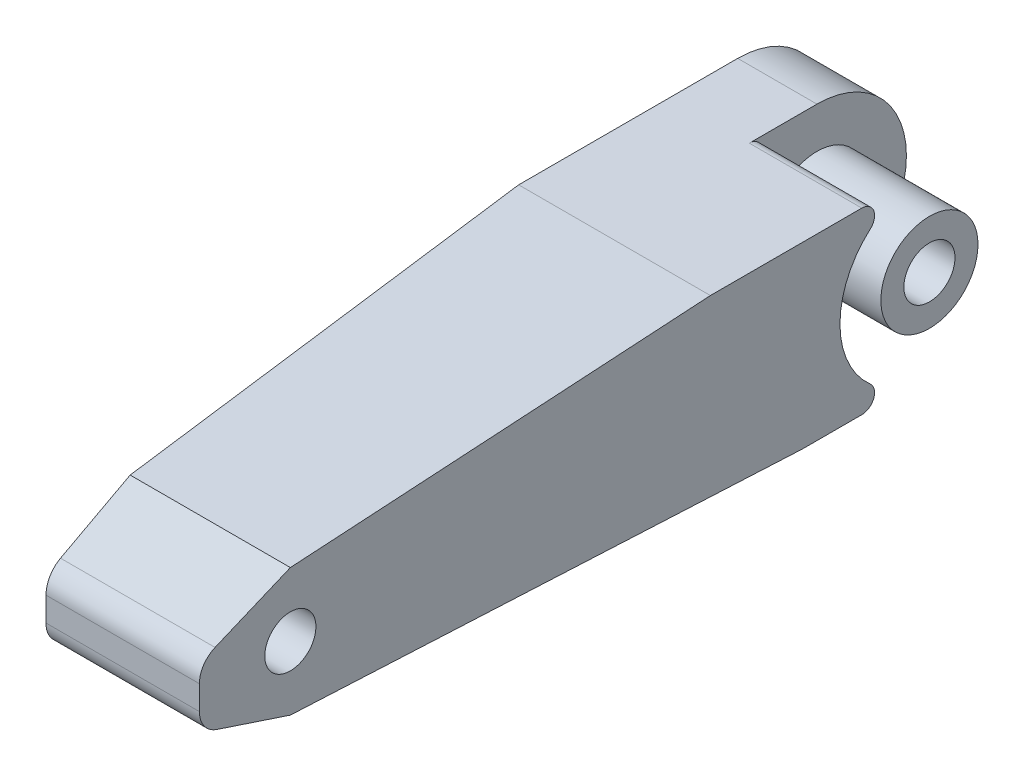
ISO-10303-21;
HEADER;
FILE_DESCRIPTION(('STEP AP214'),'2;1');
FILE_NAME('part.step','',(''),(''),'','','');
FILE_SCHEMA(('AUTOMOTIVE_DESIGN { 1 0 10303 214 1 1 1 1 }'));
ENDSEC;
DATA;
#1=APPLICATION_CONTEXT('core data for automotive mechanical design processes');
#2=APPLICATION_PROTOCOL_DEFINITION('international standard','automotive_design',2000,#1);
#3=PRODUCT_CONTEXT('',#1,'mechanical');
#4=PRODUCT('Part','Part','',(#3));
#5=PRODUCT_RELATED_PRODUCT_CATEGORY('part','',(#4));
#6=PRODUCT_DEFINITION_FORMATION('','',#4);
#7=PRODUCT_DEFINITION_CONTEXT('part definition',#1,'design');
#8=PRODUCT_DEFINITION('design','',#6,#7);
#9=PRODUCT_DEFINITION_SHAPE('','',#8);
#10=(LENGTH_UNIT() NAMED_UNIT(*) SI_UNIT(.MILLI.,.METRE.));
#11=(NAMED_UNIT(*) PLANE_ANGLE_UNIT() SI_UNIT($,.RADIAN.));
#12=(NAMED_UNIT(*) SI_UNIT($,.STERADIAN.) SOLID_ANGLE_UNIT());
#13=UNCERTAINTY_MEASURE_WITH_UNIT(LENGTH_MEASURE(1.E-05),#10,'distance_accuracy_value','');
#14=(GEOMETRIC_REPRESENTATION_CONTEXT(3) GLOBAL_UNCERTAINTY_ASSIGNED_CONTEXT((#13)) GLOBAL_UNIT_ASSIGNED_CONTEXT((#10,
#11,#12)) REPRESENTATION_CONTEXT('',''));
#15=CARTESIAN_POINT('',(0.,0.,0.));
#16=DIRECTION('',(0.,0.,1.));
#17=DIRECTION('',(1.,0.,0.));
#18=AXIS2_PLACEMENT_3D('',#15,#16,#17);
#19=CARTESIAN_POINT('',(-7.5,0.,-12.5));
#20=DIRECTION('',(1.,0.,0.));
#21=DIRECTION('',(0.,0.,-1.));
#22=AXIS2_PLACEMENT_3D('',#19,#20,#21);
#23=CYLINDRICAL_SURFACE('',#22,3.5);
#24=CARTESIAN_POINT('',(-4.4,0.,-12.5));
#25=DIRECTION('',(1.,0.,0.));
#26=DIRECTION('',(0.,0.,-1.));
#27=AXIS2_PLACEMENT_3D('',#24,#25,#26);
#28=CIRCLE('',#27,3.5);
#29=CARTESIAN_POINT('',(-4.4,-3.5,-12.5));
#30=VERTEX_POINT('',#29);
#31=CARTESIAN_POINT('',(-4.4,3.5,-12.5));
#32=VERTEX_POINT('',#31);
#33=EDGE_CURVE('E373',#30,#32,#28,.T.);
#34=ORIENTED_EDGE('',*,*,#33,.F.);
#35=DIRECTION('',(1.,0.,0.));
#36=VECTOR('',#35,1.);
#37=CARTESIAN_POINT('',(-7.5,-3.5,-12.5));
#38=LINE('',#37,#36);
#39=CARTESIAN_POINT('',(-7.5,-3.5,-12.5));
#40=VERTEX_POINT('',#39);
#41=EDGE_CURVE('E437',#40,#30,#38,.T.);
#42=ORIENTED_EDGE('',*,*,#41,.F.);
#43=CARTESIAN_POINT('',(-7.5,0.,-12.5));
#44=DIRECTION('',(1.,0.,0.));
#45=DIRECTION('',(0.,0.,-1.));
#46=AXIS2_PLACEMENT_3D('',#43,#44,#45);
#47=CIRCLE('',#46,3.5);
#48=CARTESIAN_POINT('',(-7.5,3.5,-12.5));
#49=VERTEX_POINT('',#48);
#50=EDGE_CURVE('E385',#49,#40,#47,.F.);
#51=ORIENTED_EDGE('',*,*,#50,.F.);
#52=DIRECTION('',(1.,0.,0.));
#53=VECTOR('',#52,1.);
#54=CARTESIAN_POINT('',(-7.5,3.5,-12.5));
#55=LINE('',#54,#53);
#56=EDGE_CURVE('E433',#49,#32,#55,.T.);
#57=ORIENTED_EDGE('',*,*,#56,.T.);
#58=EDGE_LOOP('',(#34,#42,#51,#57));
#59=FACE_BOUND('',#58,.T.);
#60=ADVANCED_FACE('F43',(#59),#23,.T.);
#61=CARTESIAN_POINT('',(-7.5,6.58121166022719,2.75669465493529));
#62=DIRECTION('',(0.,0.922352663952775,0.386349017468946));
#63=DIRECTION('',(0.,-0.386349017468946,0.922352663952775));
#64=AXIS2_PLACEMENT_3D('',#61,#62,#63);
#65=PLANE('',#64);
#66=DIRECTION('',(-0.0690481216036212,0.385426929996774,-0.920151312848204));
#67=VECTOR('',#66,1.);
#68=CARTESIAN_POINT('',(-7.00056919332682,6.59456668704934,2.72481145086436));
#69=LINE('',#68,#67);
#70=CARTESIAN_POINT('',(-6.04604834777971,1.26642696980822,15.4449780357449));
#71=VERTEX_POINT('',#70);
#72=CARTESIAN_POINT('',(-6.26703939424432,2.5,12.5));
#73=VERTEX_POINT('',#72);
#74=EDGE_CURVE('E351',#71,#73,#69,.T.);
#75=ORIENTED_EDGE('',*,*,#74,.F.);
#76=DIRECTION('',(1.,0.,0.));
#77=VECTOR('',#76,1.);
#78=CARTESIAN_POINT('',(-7.5,1.26642696980822,15.4449780357449));
#79=LINE('',#78,#77);
#80=CARTESIAN_POINT('',(0.,1.26642696980822,15.4449780357449));
#81=VERTEX_POINT('',#80);
#82=EDGE_CURVE('E392',#71,#81,#79,.T.);
#83=ORIENTED_EDGE('',*,*,#82,.T.);
#84=DIRECTION('',(0.,-0.386349017468946,0.922352663952775));
#85=VECTOR('',#84,1.);
#86=CARTESIAN_POINT('',(0.,6.58121166022719,2.75669465493529));
#87=LINE('',#86,#85);
#88=CARTESIAN_POINT('',(0.,2.5,12.5));
#89=VERTEX_POINT('',#88);
#90=EDGE_CURVE('E372',#89,#81,#87,.T.);
#91=ORIENTED_EDGE('',*,*,#90,.F.);
#92=DIRECTION('',(1.,0.,0.));
#93=VECTOR('',#92,1.);
#94=CARTESIAN_POINT('',(-7.5,2.5,12.5));
#95=LINE('',#94,#93);
#96=EDGE_CURVE('E425',#73,#89,#95,.T.);
#97=ORIENTED_EDGE('',*,*,#96,.F.);
#98=EDGE_LOOP('',(#75,#83,#91,#97));
#99=FACE_BOUND('',#98,.T.);
#100=ADVANCED_FACE('F550',(#99),#65,.T.);
#101=CARTESIAN_POINT('',(-7.5,3.24873633277452,0.197723314979145));
#102=DIRECTION('',(0.,0.9981530617779,0.0607491996935188));
#103=DIRECTION('',(0.,-0.0607491996935188,0.9981530617779));
#104=AXIS2_PLACEMENT_3D('',#101,#102,#103);
#105=PLANE('',#104);
#106=DIRECTION('',(-0.0746921435932384,0.060579505334203,-0.995364861354323));
#107=VECTOR('',#106,1.);
#108=CARTESIAN_POINT('',(-7.19193013490415,3.25013811174686,0.174691077842942));
#109=LINE('',#108,#107);
#110=CARTESIAN_POINT('',(-7.5,3.5,-3.93071952904089));
#111=VERTEX_POINT('',#110);
#112=EDGE_CURVE('E354',#73,#111,#109,.T.);
#113=ORIENTED_EDGE('',*,*,#112,.F.);
#114=ORIENTED_EDGE('',*,*,#96,.T.);
#115=DIRECTION('',(0.,-0.0607491996935188,0.9981530617779));
#116=VECTOR('',#115,1.);
#117=CARTESIAN_POINT('',(0.,3.24873633277452,0.197723314979145));
#118=LINE('',#117,#116);
#119=CARTESIAN_POINT('',(0.,3.5,-3.93071952904089));
#120=VERTEX_POINT('',#119);
#121=EDGE_CURVE('E382',#120,#89,#118,.T.);
#122=ORIENTED_EDGE('',*,*,#121,.F.);
#123=DIRECTION('',(1.,0.,0.));
#124=VECTOR('',#123,1.);
#125=CARTESIAN_POINT('',(-7.5,3.5,-3.93071952904089));
#126=LINE('',#125,#124);
#127=EDGE_CURVE('E429',#111,#120,#126,.T.);
#128=ORIENTED_EDGE('',*,*,#127,.F.);
#129=EDGE_LOOP('',(#113,#114,#122,#128));
#130=FACE_BOUND('',#129,.T.);
#131=ADVANCED_FACE('F556',(#130),#105,.T.);
#132=CARTESIAN_POINT('',(-7.5,3.5,0.));
#133=DIRECTION('',(0.,1.,0.));
#134=DIRECTION('',(0.,0.,1.));
#135=AXIS2_PLACEMENT_3D('',#132,#133,#134);
#136=PLANE('',#135);
#137=DIRECTION('',(0.,0.,1.));
#138=VECTOR('',#137,1.);
#139=CARTESIAN_POINT('',(0.,3.5,0.));
#140=LINE('',#139,#138);
#141=CARTESIAN_POINT('',(0.,3.5,-9.85424868893541));
#142=VERTEX_POINT('',#141);
#143=EDGE_CURVE('E419',#142,#120,#140,.T.);
#144=ORIENTED_EDGE('',*,*,#143,.F.);
#145=DIRECTION('',(-1.,0.,0.));
#146=VECTOR('',#145,1.);
#147=CARTESIAN_POINT('',(-4.4,3.5,-9.85424868893541));
#148=LINE('',#147,#146);
#149=CARTESIAN_POINT('',(-4.4,3.5,-9.85424868893541));
#150=VERTEX_POINT('',#149);
#151=EDGE_CURVE('E482',#142,#150,#148,.T.);
#152=ORIENTED_EDGE('',*,*,#151,.T.);
#153=DIRECTION('',(0.,0.,-1.));
#154=VECTOR('',#153,1.);
#155=CARTESIAN_POINT('',(-4.4,3.5,0.));
#156=LINE('',#155,#154);
#157=EDGE_CURVE('E479',#150,#32,#156,.T.);
#158=ORIENTED_EDGE('',*,*,#157,.T.);
#159=ORIENTED_EDGE('',*,*,#56,.F.);
#160=DIRECTION('',(0.,0.,1.));
#161=VECTOR('',#160,1.);
#162=CARTESIAN_POINT('',(-7.5,3.5,0.));
#163=LINE('',#162,#161);
#164=EDGE_CURVE('E388',#49,#111,#163,.T.);
#165=ORIENTED_EDGE('',*,*,#164,.T.);
#166=ORIENTED_EDGE('',*,*,#127,.T.);
#167=EDGE_LOOP('',(#144,#152,#158,#159,#165,#166));
#168=FACE_BOUND('',#167,.T.);
#169=ADVANCED_FACE('F562',(#168),#136,.T.);
#170=CARTESIAN_POINT('',(-7.5,-3.5,0.));
#171=DIRECTION('',(0.,1.,0.));
#172=DIRECTION('',(0.,0.,1.));
#173=AXIS2_PLACEMENT_3D('',#170,#171,#172);
#174=PLANE('',#173);
#175=DIRECTION('',(0.,0.,1.));
#176=VECTOR('',#175,1.);
#177=CARTESIAN_POINT('',(-4.4,-3.5,-12.5));
#178=LINE('',#177,#176);
#179=CARTESIAN_POINT('',(-4.4,-3.5,-9.85424868893541));
#180=VERTEX_POINT('',#179);
#181=EDGE_CURVE('E428',#30,#180,#178,.T.);
#182=ORIENTED_EDGE('',*,*,#181,.T.);
#183=DIRECTION('',(1.,0.,0.));
#184=VECTOR('',#183,1.);
#185=CARTESIAN_POINT('',(-7.5,-3.5,-9.85424868893541));
#186=LINE('',#185,#184);
#187=CARTESIAN_POINT('',(0.,-3.5,-9.85424868893541));
#188=VERTEX_POINT('',#187);
#189=EDGE_CURVE('E462',#180,#188,#186,.T.);
#190=ORIENTED_EDGE('',*,*,#189,.T.);
#191=DIRECTION('',(0.,0.,1.));
#192=VECTOR('',#191,1.);
#193=CARTESIAN_POINT('',(0.,-3.5,0.));
#194=LINE('',#193,#192);
#195=CARTESIAN_POINT('',(0.,-3.5,-7.52880226755794));
#196=VERTEX_POINT('',#195);
#197=EDGE_CURVE('E416',#188,#196,#194,.T.);
#198=ORIENTED_EDGE('',*,*,#197,.T.);
#199=DIRECTION('',(1.,0.,0.));
#200=VECTOR('',#199,1.);
#201=CARTESIAN_POINT('',(-7.5,-3.5,-7.52880226755794));
#202=LINE('',#201,#200);
#203=CARTESIAN_POINT('',(-7.5,-3.5,-7.52880226755794));
#204=VERTEX_POINT('',#203);
#205=EDGE_CURVE('E441',#204,#196,#202,.T.);
#206=ORIENTED_EDGE('',*,*,#205,.F.);
#207=DIRECTION('',(0.,0.,1.));
#208=VECTOR('',#207,1.);
#209=CARTESIAN_POINT('',(-7.5,-3.5,0.));
#210=LINE('',#209,#208);
#211=EDGE_CURVE('E381',#40,#204,#210,.T.);
#212=ORIENTED_EDGE('',*,*,#211,.F.);
#213=ORIENTED_EDGE('',*,*,#41,.T.);
#214=EDGE_LOOP('',(#182,#190,#198,#206,#212,#213));
#215=FACE_BOUND('',#214,.T.);
#216=ADVANCED_FACE('F564',(#215),#174,.F.);
#217=CARTESIAN_POINT('',(-7.5,-3.11633278250536,0.155592568186321));
#218=DIRECTION('',(0.,0.998755917988234,-0.0498659832298602));
#219=DIRECTION('',(0.,0.0498659832298602,0.998755917988234));
#220=AXIS2_PLACEMENT_3D('',#217,#218,#219);
#221=PLANE('',#220);
#222=DIRECTION('',(1.,0.,0.));
#223=VECTOR('',#222,1.);
#224=CARTESIAN_POINT('',(-7.5,-2.5,12.5));
#225=LINE('',#224,#223);
#226=CARTESIAN_POINT('',(-6.26703939424431,-2.5,12.5));
#227=VERTEX_POINT('',#226);
#228=CARTESIAN_POINT('',(0.,-2.5,12.5));
#229=VERTEX_POINT('',#228);
#230=EDGE_CURVE('E445',#227,#229,#225,.T.);
#231=ORIENTED_EDGE('',*,*,#230,.F.);
#232=DIRECTION('',(0.074737003632309,0.0497265220033703,0.995962676658876));
#233=VECTOR('',#232,1.);
#234=CARTESIAN_POINT('',(-7.57268935882462,-3.3687186873563,-4.89939481519172));
#235=LINE('',#234,#233);
#236=CARTESIAN_POINT('',(-7.5,-3.32035457285706,-3.9307195290409));
#237=VERTEX_POINT('',#236);
#238=EDGE_CURVE('E339',#237,#227,#235,.T.);
#239=ORIENTED_EDGE('',*,*,#238,.F.);
#240=DIRECTION('',(0.,0.0498659832298602,0.998755917988234));
#241=VECTOR('',#240,1.);
#242=CARTESIAN_POINT('',(-7.5,-3.11633278250536,0.155592568186321));
#243=LINE('',#242,#241);
#244=EDGE_CURVE('E377',#204,#237,#243,.T.);
#245=ORIENTED_EDGE('',*,*,#244,.F.);
#246=ORIENTED_EDGE('',*,*,#205,.T.);
#247=DIRECTION('',(0.,0.0498659832298602,0.998755917988234));
#248=VECTOR('',#247,1.);
#249=CARTESIAN_POINT('',(0.,-3.11633278250536,0.155592568186321));
#250=LINE('',#249,#248);
#251=EDGE_CURVE('E412',#196,#229,#250,.T.);
#252=ORIENTED_EDGE('',*,*,#251,.T.);
#253=EDGE_LOOP('',(#231,#239,#245,#246,#252));
#254=FACE_BOUND('',#253,.T.);
#255=ADVANCED_FACE('F567',(#254),#221,.F.);
#256=CARTESIAN_POINT('',(-7.5,-5.98077172134062,1.9786069110226));
#257=DIRECTION('',(0.,-0.949394439923338,0.314086289803697));
#258=DIRECTION('',(0.,-0.314086289803697,-0.949394439923338));
#259=AXIS2_PLACEMENT_3D('',#256,#257,#258);
#260=PLANE('',#259);
#261=DIRECTION('',(0.0710624145134578,0.313292239115599,0.946994248215612));
#262=VECTOR('',#261,1.);
#263=CARTESIAN_POINT('',(-7.05880364622664,-5.99064406344166,1.94876559987972));
#264=LINE('',#263,#262);
#265=CARTESIAN_POINT('',(-6.05147094027897,-1.54962526128772,15.3727153080797));
#266=VERTEX_POINT('',#265);
#267=EDGE_CURVE('E360',#227,#266,#264,.T.);
#268=ORIENTED_EDGE('',*,*,#267,.F.);
#269=ORIENTED_EDGE('',*,*,#230,.T.);
#270=DIRECTION('',(0.,-0.314086289803697,-0.949394439923338));
#271=VECTOR('',#270,1.);
#272=CARTESIAN_POINT('',(0.,-5.98077172134062,1.9786069110226));
#273=LINE('',#272,#271);
#274=CARTESIAN_POINT('',(0.,-1.54962526128772,15.3727153080797));
#275=VERTEX_POINT('',#274);
#276=EDGE_CURVE('E408',#275,#229,#273,.T.);
#277=ORIENTED_EDGE('',*,*,#276,.F.);
#278=DIRECTION('',(1.,0.,0.));
#279=VECTOR('',#278,1.);
#280=CARTESIAN_POINT('',(-7.5,-1.54962526128772,15.3727153080797));
#281=LINE('',#280,#279);
#282=EDGE_CURVE('E448',#266,#275,#281,.T.);
#283=ORIENTED_EDGE('',*,*,#282,.F.);
#284=EDGE_LOOP('',(#268,#269,#277,#283));
#285=FACE_BOUND('',#284,.T.);
#286=ADVANCED_FACE('F571',(#285),#260,.T.);
#287=CARTESIAN_POINT('',(-7.5,-0.600230821364385,15.058629018276));
#288=DIRECTION('',(1.,0.,0.));
#289=DIRECTION('',(0.,0.,-1.));
#290=AXIS2_PLACEMENT_3D('',#287,#288,#289);
#291=CYLINDRICAL_SURFACE('',#290,1.);
#292=CARTESIAN_POINT('',(-6.07503996423142,-0.600230821364385,15.058629018276));
#293=DIRECTION('',(0.997196336905722,0.,-0.074829577453106));
#294=DIRECTION('',(0.074829577453106,0.,0.997196336905722));
#295=AXIS2_PLACEMENT_3D('',#292,#293,#294);
#296=ELLIPSE('',#295,1.00281154572126,1.);
#297=CARTESIAN_POINT('',(-6.,-0.600230821364379,16.058629018276));
#298=VERTEX_POINT('',#297);
#299=EDGE_CURVE('E357',#266,#298,#296,.F.);
#300=ORIENTED_EDGE('',*,*,#299,.F.);
#301=ORIENTED_EDGE('',*,*,#282,.T.);
#302=CARTESIAN_POINT('',(0.,-0.600230821364385,15.058629018276));
#303=DIRECTION('',(1.,0.,0.));
#304=DIRECTION('',(0.,0.,-1.));
#305=AXIS2_PLACEMENT_3D('',#302,#303,#304);
#306=CIRCLE('',#305,1.);
#307=CARTESIAN_POINT('',(0.,-0.60023082136438,16.058629018276));
#308=VERTEX_POINT('',#307);
#309=EDGE_CURVE('E404',#308,#275,#306,.T.);
#310=ORIENTED_EDGE('',*,*,#309,.F.);
#311=DIRECTION('',(1.,0.,0.));
#312=VECTOR('',#311,1.);
#313=CARTESIAN_POINT('',(-7.5,-0.60023082136438,16.058629018276));
#314=LINE('',#313,#312);
#315=EDGE_CURVE('E451',#298,#308,#314,.T.);
#316=ORIENTED_EDGE('',*,*,#315,.F.);
#317=EDGE_LOOP('',(#300,#301,#310,#316));
#318=FACE_BOUND('',#317,.T.);
#319=ADVANCED_FACE('F575',(#318),#291,.T.);
#320=CARTESIAN_POINT('',(-7.5,0.,16.058629018276));
#321=DIRECTION('',(0.,0.,1.));
#322=DIRECTION('',(1.,0.,0.));
#323=AXIS2_PLACEMENT_3D('',#320,#321,#322);
#324=PLANE('',#323);
#325=DIRECTION('',(0.,1.,0.));
#326=VECTOR('',#325,1.);
#327=CARTESIAN_POINT('',(-6.,-22.8793736979123,16.058629018276));
#328=LINE('',#327,#326);
#329=CARTESIAN_POINT('',(-6.,0.344074305855445,16.058629018276));
#330=VERTEX_POINT('',#329);
#331=EDGE_CURVE('E343',#298,#330,#328,.T.);
#332=ORIENTED_EDGE('',*,*,#331,.F.);
#333=ORIENTED_EDGE('',*,*,#315,.T.);
#334=DIRECTION('',(0.,-1.,0.));
#335=VECTOR('',#334,1.);
#336=CARTESIAN_POINT('',(0.,0.,16.058629018276));
#337=LINE('',#336,#335);
#338=CARTESIAN_POINT('',(0.,0.344074305855439,16.058629018276));
#339=VERTEX_POINT('',#338);
#340=EDGE_CURVE('E400',#339,#308,#337,.T.);
#341=ORIENTED_EDGE('',*,*,#340,.F.);
#342=DIRECTION('',(1.,0.,0.));
#343=VECTOR('',#342,1.);
#344=CARTESIAN_POINT('',(-7.5,0.344074305855439,16.058629018276));
#345=LINE('',#344,#343);
#346=EDGE_CURVE('E454',#330,#339,#345,.T.);
#347=ORIENTED_EDGE('',*,*,#346,.F.);
#348=EDGE_LOOP('',(#332,#333,#341,#347));
#349=FACE_BOUND('',#348,.T.);
#350=ADVANCED_FACE('F579',(#349),#324,.T.);
#351=CARTESIAN_POINT('',(-7.5,0.344074305855444,15.058629018276));
#352=DIRECTION('',(1.,0.,0.));
#353=DIRECTION('',(0.,0.,-1.));
#354=AXIS2_PLACEMENT_3D('',#351,#352,#353);
#355=CYLINDRICAL_SURFACE('',#354,1.);
#356=CARTESIAN_POINT('',(-6.07503996423142,0.344074305855444,15.058629018276));
#357=DIRECTION('',(0.997196336905722,0.,-0.074829577453106));
#358=DIRECTION('',(0.074829577453106,0.,0.997196336905722));
#359=AXIS2_PLACEMENT_3D('',#356,#357,#358);
#360=ELLIPSE('',#359,1.00281154572126,1.);
#361=EDGE_CURVE('E342',#330,#71,#360,.F.);
#362=ORIENTED_EDGE('',*,*,#361,.F.);
#363=ORIENTED_EDGE('',*,*,#346,.T.);
#364=CARTESIAN_POINT('',(0.,0.344074305855444,15.058629018276));
#365=DIRECTION('',(1.,0.,0.));
#366=DIRECTION('',(0.,0.,-1.));
#367=AXIS2_PLACEMENT_3D('',#364,#365,#366);
#368=CIRCLE('',#367,1.);
#369=EDGE_CURVE('E396',#81,#339,#368,.T.);
#370=ORIENTED_EDGE('',*,*,#369,.F.);
#371=ORIENTED_EDGE('',*,*,#82,.F.);
#372=EDGE_LOOP('',(#362,#363,#370,#371));
#373=FACE_BOUND('',#372,.T.);
#374=ADVANCED_FACE('F583',(#373),#355,.T.);
#375=CARTESIAN_POINT('',(-7.5,0.,0.));
#376=DIRECTION('',(1.,0.,0.));
#377=DIRECTION('',(0.,0.,-1.));
#378=AXIS2_PLACEMENT_3D('',#375,#376,#377);
#379=PLANE('',#378);
#380=DIRECTION('',(0.,0.,-1.));
#381=VECTOR('',#380,1.);
#382=CARTESIAN_POINT('',(-7.5,1.29903810567666,-11.75));
#383=LINE('',#382,#381);
#384=CARTESIAN_POINT('',(-7.5,1.29903810567666,-11.75));
#385=VERTEX_POINT('',#384);
#386=CARTESIAN_POINT('',(-7.5,1.29903810567666,-13.25));
#387=VERTEX_POINT('',#386);
#388=EDGE_CURVE('E912',#385,#387,#383,.T.);
#389=ORIENTED_EDGE('',*,*,#388,.F.);
#390=DIRECTION('',(0.,0.866025403784439,-0.5));
#391=VECTOR('',#390,1.);
#392=CARTESIAN_POINT('',(-7.5,0.,-11.));
#393=LINE('',#392,#391);
#394=CARTESIAN_POINT('',(-7.5,0.,-11.));
#395=VERTEX_POINT('',#394);
#396=EDGE_CURVE('E238',#395,#385,#393,.T.);
#397=ORIENTED_EDGE('',*,*,#396,.F.);
#398=DIRECTION('',(0.,0.866025403784439,0.5));
#399=VECTOR('',#398,1.);
#400=CARTESIAN_POINT('',(-7.5,-1.29903810567666,-11.75));
#401=LINE('',#400,#399);
#402=CARTESIAN_POINT('',(-7.5,-1.29903810567666,-11.75));
#403=VERTEX_POINT('',#402);
#404=EDGE_CURVE('E254',#403,#395,#401,.T.);
#405=ORIENTED_EDGE('',*,*,#404,.F.);
#406=DIRECTION('',(0.,0.,1.));
#407=VECTOR('',#406,1.);
#408=CARTESIAN_POINT('',(-7.5,-1.29903810567666,-13.25));
#409=LINE('',#408,#407);
#410=CARTESIAN_POINT('',(-7.5,-1.29903810567666,-13.25));
#411=VERTEX_POINT('',#410);
#412=EDGE_CURVE('E59',#411,#403,#409,.T.);
#413=ORIENTED_EDGE('',*,*,#412,.F.);
#414=DIRECTION('',(0.,-0.866025403784439,0.5));
#415=VECTOR('',#414,1.);
#416=CARTESIAN_POINT('',(-7.5,0.,-14.));
#417=LINE('',#416,#415);
#418=CARTESIAN_POINT('',(-7.5,0.,-14.));
#419=VERTEX_POINT('',#418);
#420=EDGE_CURVE('E250',#419,#411,#417,.T.);
#421=ORIENTED_EDGE('',*,*,#420,.F.);
#422=DIRECTION('',(0.,-0.866025403784439,-0.5));
#423=VECTOR('',#422,1.);
#424=CARTESIAN_POINT('',(-7.5,1.29903810567666,-13.25));
#425=LINE('',#424,#423);
#426=EDGE_CURVE('E914',#387,#419,#425,.T.);
#427=ORIENTED_EDGE('',*,*,#426,.F.);
#428=EDGE_LOOP('',(#389,#397,#405,#413,#421,#427));
#429=FACE_BOUND('',#428,.T.);
#430=ORIENTED_EDGE('',*,*,#244,.T.);
#431=DIRECTION('',(0.,1.,0.));
#432=VECTOR('',#431,1.);
#433=CARTESIAN_POINT('',(-7.5,-22.8793736979123,-3.93071952904089));
#434=LINE('',#433,#432);
#435=EDGE_CURVE('E333',#237,#111,#434,.T.);
#436=ORIENTED_EDGE('',*,*,#435,.T.);
#437=ORIENTED_EDGE('',*,*,#164,.F.);
#438=ORIENTED_EDGE('',*,*,#50,.T.);
#439=ORIENTED_EDGE('',*,*,#211,.T.);
#440=EDGE_LOOP('',(#430,#436,#437,#438,#439));
#441=FACE_BOUND('',#440,.T.);
#442=ADVANCED_FACE('F586',(#429,#441),#379,.F.);
#443=CARTESIAN_POINT('',(0.,0.,0.));
#444=DIRECTION('',(1.,0.,0.));
#445=DIRECTION('',(0.,0.,-1.));
#446=AXIS2_PLACEMENT_3D('',#443,#444,#445);
#447=PLANE('',#446);
#448=CARTESIAN_POINT('',(0.,0.,12.5));
#449=DIRECTION('',(1.,0.,0.));
#450=DIRECTION('',(0.,0.,-1.));
#451=AXIS2_PLACEMENT_3D('',#448,#449,#450);
#452=CIRCLE('',#451,1.);
#453=CARTESIAN_POINT('',(0.,0.,11.5));
#454=VERTEX_POINT('',#453);
#455=EDGE_CURVE('E334',#454,#454,#452,.F.);
#456=ORIENTED_EDGE('',*,*,#455,.T.);
#457=EDGE_LOOP('',(#456));
#458=FACE_BOUND('',#457,.T.);
#459=ORIENTED_EDGE('',*,*,#197,.F.);
#460=CARTESIAN_POINT('',(0.,-3.,-9.85424868893541));
#461=DIRECTION('',(1.,0.,0.));
#462=DIRECTION('',(0.,0.,-1.));
#463=AXIS2_PLACEMENT_3D('',#460,#461,#462);
#464=CIRCLE('',#463,0.5);
#465=CARTESIAN_POINT('',(0.,-2.625,-10.1849676028185));
#466=VERTEX_POINT('',#465);
#467=EDGE_CURVE('E469',#188,#466,#464,.T.);
#468=ORIENTED_EDGE('',*,*,#467,.T.);
#469=CARTESIAN_POINT('',(0.,0.,-12.5));
#470=DIRECTION('',(1.,0.,0.));
#471=DIRECTION('',(0.,0.,-1.));
#472=AXIS2_PLACEMENT_3D('',#469,#470,#471);
#473=CIRCLE('',#472,3.5);
#474=CARTESIAN_POINT('',(0.,2.625,-10.1849676028185));
#475=VERTEX_POINT('',#474);
#476=EDGE_CURVE('E367',#475,#466,#473,.T.);
#477=ORIENTED_EDGE('',*,*,#476,.F.);
#478=CARTESIAN_POINT('',(0.,3.,-9.85424868893541));
#479=DIRECTION('',(1.,0.,0.));
#480=DIRECTION('',(0.,0.,-1.));
#481=AXIS2_PLACEMENT_3D('',#478,#479,#480);
#482=CIRCLE('',#481,0.5);
#483=EDGE_CURVE('E466',#475,#142,#482,.T.);
#484=ORIENTED_EDGE('',*,*,#483,.T.);
#485=ORIENTED_EDGE('',*,*,#143,.T.);
#486=ORIENTED_EDGE('',*,*,#121,.T.);
#487=ORIENTED_EDGE('',*,*,#90,.T.);
#488=ORIENTED_EDGE('',*,*,#369,.T.);
#489=ORIENTED_EDGE('',*,*,#340,.T.);
#490=ORIENTED_EDGE('',*,*,#309,.T.);
#491=ORIENTED_EDGE('',*,*,#276,.T.);
#492=ORIENTED_EDGE('',*,*,#251,.F.);
#493=EDGE_LOOP('',(#459,#468,#477,#484,#485,#486,#487,#488,#489,#490,#491,#492));
#494=FACE_BOUND('',#493,.T.);
#495=ADVANCED_FACE('F621',(#458,#494),#447,.T.);
#496=CARTESIAN_POINT('',(-4.4,0.,-12.5));
#497=DIRECTION('',(1.,0.,0.));
#498=DIRECTION('',(0.,0.,-1.));
#499=AXIS2_PLACEMENT_3D('',#496,#497,#498);
#500=CYLINDRICAL_SURFACE('',#499,3.5);
#501=ORIENTED_EDGE('',*,*,#476,.T.);
#502=DIRECTION('',(1.,0.,0.));
#503=VECTOR('',#502,1.);
#504=CARTESIAN_POINT('',(-4.4,-2.625,-10.1849676028185));
#505=LINE('',#504,#503);
#506=CARTESIAN_POINT('',(-4.4,-2.625,-10.1849676028185));
#507=VERTEX_POINT('',#506);
#508=EDGE_CURVE('E476',#466,#507,#505,.F.);
#509=ORIENTED_EDGE('',*,*,#508,.T.);
#510=CARTESIAN_POINT('',(-4.4,2.625,-10.1849676028185));
#511=VERTEX_POINT('',#510);
#512=EDGE_CURVE('E368',#511,#507,#28,.T.);
#513=ORIENTED_EDGE('',*,*,#512,.F.);
#514=DIRECTION('',(1.,0.,0.));
#515=VECTOR('',#514,1.);
#516=CARTESIAN_POINT('',(-4.4,2.625,-10.1849676028185));
#517=LINE('',#516,#515);
#518=EDGE_CURVE('E472',#511,#475,#517,.T.);
#519=ORIENTED_EDGE('',*,*,#518,.T.);
#520=EDGE_LOOP('',(#501,#509,#513,#519));
#521=FACE_BOUND('',#520,.T.);
#522=ADVANCED_FACE('F598',(#521),#500,.F.);
#523=CARTESIAN_POINT('',(-4.4,0.,-12.5));
#524=DIRECTION('',(1.,0.,0.));
#525=DIRECTION('',(0.,0.,-1.));
#526=AXIS2_PLACEMENT_3D('',#523,#524,#525);
#527=PLANE('',#526);
#528=CARTESIAN_POINT('',(-4.4,0.,-12.5));
#529=DIRECTION('',(1.,0.,0.));
#530=DIRECTION('',(0.,0.,-1.));
#531=AXIS2_PLACEMENT_3D('',#528,#529,#530);
#532=CIRCLE('',#531,1.9);
#533=CARTESIAN_POINT('',(-4.4,0.,-14.4));
#534=VERTEX_POINT('',#533);
#535=EDGE_CURVE('E492',#534,#534,#532,.T.);
#536=ORIENTED_EDGE('',*,*,#535,.F.);
#537=EDGE_LOOP('',(#536));
#538=FACE_BOUND('',#537,.T.);
#539=ORIENTED_EDGE('',*,*,#33,.T.);
#540=ORIENTED_EDGE('',*,*,#157,.F.);
#541=CARTESIAN_POINT('',(-4.4,3.,-9.85424868893541));
#542=DIRECTION('',(1.,0.,0.));
#543=DIRECTION('',(0.,0.,-1.));
#544=AXIS2_PLACEMENT_3D('',#541,#542,#543);
#545=CIRCLE('',#544,0.5);
#546=EDGE_CURVE('E489',#150,#511,#545,.F.);
#547=ORIENTED_EDGE('',*,*,#546,.T.);
#548=ORIENTED_EDGE('',*,*,#512,.T.);
#549=CARTESIAN_POINT('',(-4.4,-3.,-9.85424868893541));
#550=DIRECTION('',(1.,0.,0.));
#551=DIRECTION('',(0.,0.,-1.));
#552=AXIS2_PLACEMENT_3D('',#549,#550,#551);
#553=CIRCLE('',#552,0.5);
#554=EDGE_CURVE('E486',#507,#180,#553,.F.);
#555=ORIENTED_EDGE('',*,*,#554,.T.);
#556=ORIENTED_EDGE('',*,*,#181,.F.);
#557=EDGE_LOOP('',(#539,#540,#547,#548,#555,#556));
#558=FACE_BOUND('',#557,.T.);
#559=ADVANCED_FACE('F590',(#538,#558),#527,.T.);
#560=CARTESIAN_POINT('',(-4.4,-3.,-9.85424868893541));
#561=DIRECTION('',(1.,0.,0.));
#562=DIRECTION('',(0.,0.,-1.));
#563=AXIS2_PLACEMENT_3D('',#560,#561,#562);
#564=CYLINDRICAL_SURFACE('',#563,0.5);
#565=ORIENTED_EDGE('',*,*,#554,.F.);
#566=ORIENTED_EDGE('',*,*,#508,.F.);
#567=ORIENTED_EDGE('',*,*,#467,.F.);
#568=ORIENTED_EDGE('',*,*,#189,.F.);
#569=EDGE_LOOP('',(#565,#566,#567,#568));
#570=FACE_BOUND('',#569,.T.);
#571=ADVANCED_FACE('F588',(#570),#564,.T.);
#572=CARTESIAN_POINT('',(-4.4,3.,-9.85424868893541));
#573=DIRECTION('',(1.,0.,0.));
#574=DIRECTION('',(0.,0.,-1.));
#575=AXIS2_PLACEMENT_3D('',#572,#573,#574);
#576=CYLINDRICAL_SURFACE('',#575,0.5);
#577=ORIENTED_EDGE('',*,*,#546,.F.);
#578=ORIENTED_EDGE('',*,*,#151,.F.);
#579=ORIENTED_EDGE('',*,*,#483,.F.);
#580=ORIENTED_EDGE('',*,*,#518,.F.);
#581=EDGE_LOOP('',(#577,#578,#579,#580));
#582=FACE_BOUND('',#581,.T.);
#583=ADVANCED_FACE('F45',(#582),#576,.T.);
#584=CARTESIAN_POINT('',(0.,0.,0.));
#585=DIRECTION('',(1.,0.,0.));
#586=DIRECTION('',(0.,0.,-1.));
#587=AXIS2_PLACEMENT_3D('',#584,#585,#586);
#588=PLANE('',#587);
#589=CARTESIAN_POINT('',(0.,0.,-12.5));
#590=DIRECTION('',(1.,0.,0.));
#591=DIRECTION('',(0.,0.,-1.));
#592=AXIS2_PLACEMENT_3D('',#589,#590,#591);
#593=CIRCLE('',#592,1.);
#594=CARTESIAN_POINT('',(0.,0.,-13.5));
#595=VERTEX_POINT('',#594);
#596=EDGE_CURVE('E329',#595,#595,#593,.F.);
#597=ORIENTED_EDGE('',*,*,#596,.T.);
#598=EDGE_LOOP('',(#597));
#599=FACE_BOUND('',#598,.T.);
#600=CARTESIAN_POINT('',(0.,0.,-12.5));
#601=DIRECTION('',(1.,0.,0.));
#602=DIRECTION('',(0.,0.,-1.));
#603=AXIS2_PLACEMENT_3D('',#600,#601,#602);
#604=CIRCLE('',#603,1.9);
#605=CARTESIAN_POINT('',(0.,0.,-14.4));
#606=VERTEX_POINT('',#605);
#607=EDGE_CURVE('E363',#606,#606,#604,.F.);
#608=ORIENTED_EDGE('',*,*,#607,.F.);
#609=EDGE_LOOP('',(#608));
#610=FACE_BOUND('',#609,.T.);
#611=ADVANCED_FACE('F596',(#599,#610),#588,.T.);
#612=CARTESIAN_POINT('',(5.37401153701776,0.,-12.5));
#613=DIRECTION('',(-1.,0.,0.));
#614=DIRECTION('',(0.,0.,1.));
#615=AXIS2_PLACEMENT_3D('',#612,#613,#614);
#616=CYLINDRICAL_SURFACE('',#615,1.9);
#617=ORIENTED_EDGE('',*,*,#535,.T.);
#618=EDGE_LOOP('',(#617));
#619=FACE_BOUND('',#618,.T.);
#620=ORIENTED_EDGE('',*,*,#607,.T.);
#621=EDGE_LOOP('',(#620));
#622=FACE_BOUND('',#621,.T.);
#623=ADVANCED_FACE('F649',(#619,#622),#616,.T.);
#624=CARTESIAN_POINT('',(-7.5,-22.8793736979123,-3.93071952904089));
#625=DIRECTION('',(0.997196336905722,0.,-0.074829577453106));
#626=DIRECTION('',(-0.0748295774531061,0.,-0.997196336905722));
#627=AXIS2_PLACEMENT_3D('',#624,#625,#626);
#628=PLANE('',#627);
#629=DIRECTION('',(0.0748295774531061,0.,0.997196336905722));
#630=VECTOR('',#629,1.);
#631=CARTESIAN_POINT('',(-7.5,1.29903810567666,-3.93071952904089));
#632=LINE('',#631,#630);
#633=CARTESIAN_POINT('',(-6.32331936741788,1.29903810567666,11.75));
#634=VERTEX_POINT('',#633);
#635=CARTESIAN_POINT('',(-6.21075942107075,1.29903810567666,13.25));
#636=VERTEX_POINT('',#635);
#637=EDGE_CURVE('E52',#634,#636,#632,.T.);
#638=ORIENTED_EDGE('',*,*,#637,.T.);
#639=DIRECTION('',(0.0374936006066129,-0.865416473401774,0.499648433879651));
#640=VECTOR('',#639,1.);
#641=CARTESIAN_POINT('',(-5.74989790579181,-9.3384344450112,19.3915476406369));
#642=LINE('',#641,#640);
#643=CARTESIAN_POINT('',(-6.15447944789719,0.,14.));
#644=VERTEX_POINT('',#643);
#645=EDGE_CURVE('E12',#636,#644,#642,.T.);
#646=ORIENTED_EDGE('',*,*,#645,.T.);
#647=DIRECTION('',(-0.0374936006066129,-0.865416473401774,-0.499648433879651));
#648=VECTOR('',#647,1.);
#649=CARTESIAN_POINT('',(-7.23465850486824,-24.9323813931455,-0.394717108870974));
#650=LINE('',#649,#648);
#651=CARTESIAN_POINT('',(-6.21075942107075,-1.29903810567666,13.25));
#652=VERTEX_POINT('',#651);
#653=EDGE_CURVE('E496',#644,#652,#650,.T.);
#654=ORIENTED_EDGE('',*,*,#653,.T.);
#655=DIRECTION('',(-0.0748295774531061,0.,-0.997196336905722));
#656=VECTOR('',#655,1.);
#657=CARTESIAN_POINT('',(-7.5,-1.29903810567666,-3.93071952904089));
#658=LINE('',#657,#656);
#659=CARTESIAN_POINT('',(-6.32331936741788,-1.29903810567666,11.75));
#660=VERTEX_POINT('',#659);
#661=EDGE_CURVE('E506',#652,#660,#658,.T.);
#662=ORIENTED_EDGE('',*,*,#661,.T.);
#663=DIRECTION('',(-0.0374936006066129,0.865416473401774,-0.499648433879651));
#664=VECTOR('',#663,1.);
#665=CARTESIAN_POINT('',(-5.91850047520424,-10.6429509974182,17.1447106233314));
#666=LINE('',#665,#664);
#667=CARTESIAN_POINT('',(-6.37959934059144,0.,11.));
#668=VERTEX_POINT('',#667);
#669=EDGE_CURVE('E510',#660,#668,#666,.T.);
#670=ORIENTED_EDGE('',*,*,#669,.T.);
#671=DIRECTION('',(0.0374936006066128,0.865416473401775,0.499648433879651));
#672=VECTOR('',#671,1.);
#673=CARTESIAN_POINT('',(-7.40326107428067,-23.6278648407385,-2.64155412617645));
#674=LINE('',#673,#672);
#675=EDGE_CURVE('E514',#668,#634,#674,.T.);
#676=ORIENTED_EDGE('',*,*,#675,.T.);
#677=EDGE_LOOP('',(#638,#646,#654,#662,#670,#676));
#678=FACE_BOUND('',#677,.T.);
#679=ORIENTED_EDGE('',*,*,#267,.T.);
#680=ORIENTED_EDGE('',*,*,#299,.T.);
#681=ORIENTED_EDGE('',*,*,#331,.T.);
#682=ORIENTED_EDGE('',*,*,#361,.T.);
#683=ORIENTED_EDGE('',*,*,#74,.T.);
#684=ORIENTED_EDGE('',*,*,#112,.T.);
#685=ORIENTED_EDGE('',*,*,#435,.F.);
#686=ORIENTED_EDGE('',*,*,#238,.T.);
#687=EDGE_LOOP('',(#679,#680,#681,#682,#683,#684,#685,#686));
#688=FACE_BOUND('',#687,.T.);
#689=ADVANCED_FACE('F520',(#678,#688),#628,.F.);
#690=CARTESIAN_POINT('',(2.82842712474619,0.,12.5));
#691=DIRECTION('',(-1.,0.,0.));
#692=DIRECTION('',(0.,0.,1.));
#693=AXIS2_PLACEMENT_3D('',#690,#691,#692);
#694=CYLINDRICAL_SURFACE('',#693,1.);
#695=CARTESIAN_POINT('',(-1.5,0.,12.5));
#696=DIRECTION('',(1.,0.,0.));
#697=DIRECTION('',(0.,0.,-1.));
#698=AXIS2_PLACEMENT_3D('',#695,#696,#697);
#699=CIRCLE('',#698,1.);
#700=CARTESIAN_POINT('',(-1.5,0.,11.5));
#701=VERTEX_POINT('',#700);
#702=EDGE_CURVE('E338',#701,#701,#699,.F.);
#703=ORIENTED_EDGE('',*,*,#702,.T.);
#704=EDGE_LOOP('',(#703));
#705=FACE_BOUND('',#704,.T.);
#706=ORIENTED_EDGE('',*,*,#455,.F.);
#707=EDGE_LOOP('',(#706));
#708=FACE_BOUND('',#707,.T.);
#709=ADVANCED_FACE('F648',(#705,#708),#694,.F.);
#710=CARTESIAN_POINT('',(2.82842712474619,0.,-12.5));
#711=DIRECTION('',(-1.,0.,0.));
#712=DIRECTION('',(0.,0.,1.));
#713=AXIS2_PLACEMENT_3D('',#710,#711,#712);
#714=CYLINDRICAL_SURFACE('',#713,1.);
#715=CARTESIAN_POINT('',(-1.5,0.,-12.5));
#716=DIRECTION('',(1.,0.,0.));
#717=DIRECTION('',(0.,0.,-1.));
#718=AXIS2_PLACEMENT_3D('',#715,#716,#717);
#719=CIRCLE('',#718,1.);
#720=CARTESIAN_POINT('',(-1.5,0.,-13.5));
#721=VERTEX_POINT('',#720);
#722=EDGE_CURVE('E282',#721,#721,#719,.F.);
#723=ORIENTED_EDGE('',*,*,#722,.T.);
#724=EDGE_LOOP('',(#723));
#725=FACE_BOUND('',#724,.T.);
#726=ORIENTED_EDGE('',*,*,#596,.F.);
#727=EDGE_LOOP('',(#726));
#728=FACE_BOUND('',#727,.T.);
#729=ADVANCED_FACE('F655',(#725,#728),#714,.F.);
#730=CARTESIAN_POINT('',(-1.5,0.,0.));
#731=DIRECTION('',(1.,0.,0.));
#732=DIRECTION('',(0.,0.,-1.));
#733=AXIS2_PLACEMENT_3D('',#730,#731,#732);
#734=PLANE('',#733);
#735=DIRECTION('',(0.,0.866025403784439,0.5));
#736=VECTOR('',#735,1.);
#737=CARTESIAN_POINT('',(-1.5,-1.29903810567666,-11.75));
#738=LINE('',#737,#736);
#739=CARTESIAN_POINT('',(-1.5,-1.29903810567666,-11.75));
#740=VERTEX_POINT('',#739);
#741=CARTESIAN_POINT('',(-1.5,0.,-11.));
#742=VERTEX_POINT('',#741);
#743=EDGE_CURVE('E245',#740,#742,#738,.T.);
#744=ORIENTED_EDGE('',*,*,#743,.T.);
#745=DIRECTION('',(0.,0.866025403784439,-0.5));
#746=VECTOR('',#745,1.);
#747=CARTESIAN_POINT('',(-1.5,0.,-11.));
#748=LINE('',#747,#746);
#749=CARTESIAN_POINT('',(-1.5,1.29903810567666,-11.75));
#750=VERTEX_POINT('',#749);
#751=EDGE_CURVE('E235',#742,#750,#748,.T.);
#752=ORIENTED_EDGE('',*,*,#751,.T.);
#753=DIRECTION('',(0.,0.,-1.));
#754=VECTOR('',#753,1.);
#755=CARTESIAN_POINT('',(-1.5,1.29903810567666,-11.75));
#756=LINE('',#755,#754);
#757=CARTESIAN_POINT('',(-1.5,1.29903810567666,-13.25));
#758=VERTEX_POINT('',#757);
#759=EDGE_CURVE('E221',#750,#758,#756,.T.);
#760=ORIENTED_EDGE('',*,*,#759,.T.);
#761=DIRECTION('',(0.,-0.866025403784439,-0.5));
#762=VECTOR('',#761,1.);
#763=CARTESIAN_POINT('',(-1.5,1.29903810567666,-13.25));
#764=LINE('',#763,#762);
#765=CARTESIAN_POINT('',(-1.5,0.,-14.));
#766=VERTEX_POINT('',#765);
#767=EDGE_CURVE('E269',#758,#766,#764,.T.);
#768=ORIENTED_EDGE('',*,*,#767,.T.);
#769=DIRECTION('',(0.,-0.866025403784439,0.5));
#770=VECTOR('',#769,1.);
#771=CARTESIAN_POINT('',(-1.5,0.,-14.));
#772=LINE('',#771,#770);
#773=CARTESIAN_POINT('',(-1.5,-1.29903810567666,-13.25));
#774=VERTEX_POINT('',#773);
#775=EDGE_CURVE('E264',#766,#774,#772,.T.);
#776=ORIENTED_EDGE('',*,*,#775,.T.);
#777=DIRECTION('',(0.,0.,1.));
#778=VECTOR('',#777,1.);
#779=CARTESIAN_POINT('',(-1.5,-1.29903810567666,-13.25));
#780=LINE('',#779,#778);
#781=EDGE_CURVE('E260',#774,#740,#780,.T.);
#782=ORIENTED_EDGE('',*,*,#781,.T.);
#783=EDGE_LOOP('',(#744,#752,#760,#768,#776,#782));
#784=FACE_BOUND('',#783,.T.);
#785=ORIENTED_EDGE('',*,*,#722,.F.);
#786=EDGE_LOOP('',(#785));
#787=FACE_BOUND('',#786,.T.);
#788=ADVANCED_FACE('F242',(#784,#787),#734,.F.);
#789=CARTESIAN_POINT('',(3.96862696659689,0.,-11.));
#790=DIRECTION('',(0.,0.5,0.866025403784438));
#791=DIRECTION('',(0.,-0.866025403784439,0.5));
#792=AXIS2_PLACEMENT_3D('',#789,#790,#791);
#793=PLANE('',#792);
#794=DIRECTION('',(-1.,0.,0.));
#795=VECTOR('',#794,1.);
#796=CARTESIAN_POINT('',(3.96862696659689,0.,-11.));
#797=LINE('',#796,#795);
#798=EDGE_CURVE('E258',#742,#395,#797,.T.);
#799=ORIENTED_EDGE('',*,*,#798,.T.);
#800=ORIENTED_EDGE('',*,*,#396,.T.);
#801=DIRECTION('',(-1.,0.,0.));
#802=VECTOR('',#801,1.);
#803=CARTESIAN_POINT('',(3.96862696659689,1.29903810567666,-11.75));
#804=LINE('',#803,#802);
#805=EDGE_CURVE('E225',#750,#385,#804,.T.);
#806=ORIENTED_EDGE('',*,*,#805,.F.);
#807=ORIENTED_EDGE('',*,*,#751,.F.);
#808=EDGE_LOOP('',(#799,#800,#806,#807));
#809=FACE_BOUND('',#808,.T.);
#810=ADVANCED_FACE('F234',(#809),#793,.F.);
#811=CARTESIAN_POINT('',(3.96862696659689,1.29903810567666,-11.75));
#812=DIRECTION('',(0.,1.,0.));
#813=DIRECTION('',(0.,0.,1.));
#814=AXIS2_PLACEMENT_3D('',#811,#812,#813);
#815=PLANE('',#814);
#816=ORIENTED_EDGE('',*,*,#805,.T.);
#817=ORIENTED_EDGE('',*,*,#388,.T.);
#818=DIRECTION('',(-1.,0.,0.));
#819=VECTOR('',#818,1.);
#820=CARTESIAN_POINT('',(3.96862696659689,1.29903810567666,-13.25));
#821=LINE('',#820,#819);
#822=EDGE_CURVE('E227',#758,#387,#821,.T.);
#823=ORIENTED_EDGE('',*,*,#822,.F.);
#824=ORIENTED_EDGE('',*,*,#759,.F.);
#825=EDGE_LOOP('',(#816,#817,#823,#824));
#826=FACE_BOUND('',#825,.T.);
#827=ADVANCED_FACE('F223',(#826),#815,.F.);
#828=CARTESIAN_POINT('',(3.96862696659689,1.29903810567666,-13.25));
#829=DIRECTION('',(0.,0.5,-0.866025403784439));
#830=DIRECTION('',(0.,0.866025403784439,0.5));
#831=AXIS2_PLACEMENT_3D('',#828,#829,#830);
#832=PLANE('',#831);
#833=ORIENTED_EDGE('',*,*,#822,.T.);
#834=ORIENTED_EDGE('',*,*,#426,.T.);
#835=DIRECTION('',(-1.,0.,0.));
#836=VECTOR('',#835,1.);
#837=CARTESIAN_POINT('',(3.96862696659689,0.,-14.));
#838=LINE('',#837,#836);
#839=EDGE_CURVE('E268',#766,#419,#838,.T.);
#840=ORIENTED_EDGE('',*,*,#839,.F.);
#841=ORIENTED_EDGE('',*,*,#767,.F.);
#842=EDGE_LOOP('',(#833,#834,#840,#841));
#843=FACE_BOUND('',#842,.T.);
#844=ADVANCED_FACE('F814',(#843),#832,.F.);
#845=CARTESIAN_POINT('',(3.96862696659689,0.,-14.));
#846=DIRECTION('',(0.,-0.5,-0.866025403784439));
#847=DIRECTION('',(0.,0.866025403784439,-0.5));
#848=AXIS2_PLACEMENT_3D('',#845,#846,#847);
#849=PLANE('',#848);
#850=ORIENTED_EDGE('',*,*,#839,.T.);
#851=ORIENTED_EDGE('',*,*,#420,.T.);
#852=DIRECTION('',(-1.,0.,0.));
#853=VECTOR('',#852,1.);
#854=CARTESIAN_POINT('',(3.96862696659689,-1.29903810567666,-13.25));
#855=LINE('',#854,#853);
#856=EDGE_CURVE('E263',#774,#411,#855,.T.);
#857=ORIENTED_EDGE('',*,*,#856,.F.);
#858=ORIENTED_EDGE('',*,*,#775,.F.);
#859=EDGE_LOOP('',(#850,#851,#857,#858));
#860=FACE_BOUND('',#859,.T.);
#861=ADVANCED_FACE('F822',(#860),#849,.F.);
#862=CARTESIAN_POINT('',(3.96862696659689,-1.29903810567666,-13.25));
#863=DIRECTION('',(0.,-1.,0.));
#864=DIRECTION('',(0.,0.,-1.));
#865=AXIS2_PLACEMENT_3D('',#862,#863,#864);
#866=PLANE('',#865);
#867=ORIENTED_EDGE('',*,*,#856,.T.);
#868=ORIENTED_EDGE('',*,*,#412,.T.);
#869=DIRECTION('',(-1.,0.,0.));
#870=VECTOR('',#869,1.);
#871=CARTESIAN_POINT('',(3.96862696659689,-1.29903810567666,-11.75));
#872=LINE('',#871,#870);
#873=EDGE_CURVE('E259',#740,#403,#872,.T.);
#874=ORIENTED_EDGE('',*,*,#873,.F.);
#875=ORIENTED_EDGE('',*,*,#781,.F.);
#876=EDGE_LOOP('',(#867,#868,#874,#875));
#877=FACE_BOUND('',#876,.T.);
#878=ADVANCED_FACE('F831',(#877),#866,.F.);
#879=CARTESIAN_POINT('',(3.96862696659689,-1.29903810567666,-11.75));
#880=DIRECTION('',(0.,-0.5,0.866025403784438));
#881=DIRECTION('',(0.,-0.866025403784439,-0.5));
#882=AXIS2_PLACEMENT_3D('',#879,#880,#881);
#883=PLANE('',#882);
#884=ORIENTED_EDGE('',*,*,#873,.T.);
#885=ORIENTED_EDGE('',*,*,#404,.T.);
#886=ORIENTED_EDGE('',*,*,#798,.F.);
#887=ORIENTED_EDGE('',*,*,#743,.F.);
#888=EDGE_LOOP('',(#884,#885,#886,#887));
#889=FACE_BOUND('',#888,.T.);
#890=ADVANCED_FACE('F840',(#889),#883,.F.);
#891=CARTESIAN_POINT('',(3.96862696659689,0.,14.));
#892=DIRECTION('',(0.,0.5,0.866025403784438));
#893=DIRECTION('',(0.,-0.866025403784439,0.5));
#894=AXIS2_PLACEMENT_3D('',#891,#892,#893);
#895=PLANE('',#894);
#896=DIRECTION('',(-1.,0.,0.));
#897=VECTOR('',#896,1.);
#898=CARTESIAN_POINT('',(3.96862696659689,1.29903810567666,13.25));
#899=LINE('',#898,#897);
#900=CARTESIAN_POINT('',(-1.5,1.29903810567666,13.25));
#901=VERTEX_POINT('',#900);
#902=EDGE_CURVE('E287',#901,#636,#899,.T.);
#903=ORIENTED_EDGE('',*,*,#902,.F.);
#904=DIRECTION('',(0.,0.866025403784439,-0.5));
#905=VECTOR('',#904,1.);
#906=CARTESIAN_POINT('',(-1.5,0.,14.));
#907=LINE('',#906,#905);
#908=CARTESIAN_POINT('',(-1.5,0.,14.));
#909=VERTEX_POINT('',#908);
#910=EDGE_CURVE('E283',#909,#901,#907,.T.);
#911=ORIENTED_EDGE('',*,*,#910,.F.);
#912=DIRECTION('',(-1.,0.,0.));
#913=VECTOR('',#912,1.);
#914=CARTESIAN_POINT('',(3.96862696659689,0.,14.));
#915=LINE('',#914,#913);
#916=EDGE_CURVE('E292',#909,#644,#915,.T.);
#917=ORIENTED_EDGE('',*,*,#916,.T.);
#918=ORIENTED_EDGE('',*,*,#645,.F.);
#919=EDGE_LOOP('',(#903,#911,#917,#918));
#920=FACE_BOUND('',#919,.T.);
#921=ADVANCED_FACE('F533',(#920),#895,.F.);
#922=CARTESIAN_POINT('',(3.96862696659689,1.29903810567666,13.25));
#923=DIRECTION('',(0.,1.,0.));
#924=DIRECTION('',(0.,0.,1.));
#925=AXIS2_PLACEMENT_3D('',#922,#923,#924);
#926=PLANE('',#925);
#927=DIRECTION('',(-1.,0.,0.));
#928=VECTOR('',#927,1.);
#929=CARTESIAN_POINT('',(3.96862696659689,1.29903810567666,11.75));
#930=LINE('',#929,#928);
#931=CARTESIAN_POINT('',(-1.5,1.29903810567666,11.75));
#932=VERTEX_POINT('',#931);
#933=EDGE_CURVE('E307',#932,#634,#930,.T.);
#934=ORIENTED_EDGE('',*,*,#933,.F.);
#935=DIRECTION('',(0.,0.,-1.));
#936=VECTOR('',#935,1.);
#937=CARTESIAN_POINT('',(-1.5,1.29903810567666,13.25));
#938=LINE('',#937,#936);
#939=EDGE_CURVE('E308',#901,#932,#938,.T.);
#940=ORIENTED_EDGE('',*,*,#939,.F.);
#941=ORIENTED_EDGE('',*,*,#902,.T.);
#942=ORIENTED_EDGE('',*,*,#637,.F.);
#943=EDGE_LOOP('',(#934,#940,#941,#942));
#944=FACE_BOUND('',#943,.T.);
#945=ADVANCED_FACE('F524',(#944),#926,.F.);
#946=CARTESIAN_POINT('',(3.96862696659689,1.29903810567666,11.75));
#947=DIRECTION('',(0.,0.5,-0.866025403784439));
#948=DIRECTION('',(0.,0.866025403784439,0.5));
#949=AXIS2_PLACEMENT_3D('',#946,#947,#948);
#950=PLANE('',#949);
#951=DIRECTION('',(-1.,0.,0.));
#952=VECTOR('',#951,1.);
#953=CARTESIAN_POINT('',(3.96862696659689,0.,11.));
#954=LINE('',#953,#952);
#955=CARTESIAN_POINT('',(-1.5,0.,11.));
#956=VERTEX_POINT('',#955);
#957=EDGE_CURVE('E302',#956,#668,#954,.T.);
#958=ORIENTED_EDGE('',*,*,#957,.F.);
#959=DIRECTION('',(0.,-0.866025403784439,-0.5));
#960=VECTOR('',#959,1.);
#961=CARTESIAN_POINT('',(-1.5,1.29903810567666,11.75));
#962=LINE('',#961,#960);
#963=EDGE_CURVE('E303',#932,#956,#962,.T.);
#964=ORIENTED_EDGE('',*,*,#963,.F.);
#965=ORIENTED_EDGE('',*,*,#933,.T.);
#966=ORIENTED_EDGE('',*,*,#675,.F.);
#967=EDGE_LOOP('',(#958,#964,#965,#966));
#968=FACE_BOUND('',#967,.T.);
#969=ADVANCED_FACE('F528',(#968),#950,.F.);
#970=CARTESIAN_POINT('',(3.96862696659689,0.,11.));
#971=DIRECTION('',(0.,-0.5,-0.866025403784438));
#972=DIRECTION('',(0.,0.866025403784439,-0.5));
#973=AXIS2_PLACEMENT_3D('',#970,#971,#972);
#974=PLANE('',#973);
#975=DIRECTION('',(-1.,0.,0.));
#976=VECTOR('',#975,1.);
#977=CARTESIAN_POINT('',(3.96862696659689,-1.29903810567666,11.75));
#978=LINE('',#977,#976);
#979=CARTESIAN_POINT('',(-1.5,-1.29903810567666,11.75));
#980=VERTEX_POINT('',#979);
#981=EDGE_CURVE('E297',#980,#660,#978,.T.);
#982=ORIENTED_EDGE('',*,*,#981,.F.);
#983=DIRECTION('',(0.,-0.866025403784439,0.5));
#984=VECTOR('',#983,1.);
#985=CARTESIAN_POINT('',(-1.5,0.,11.));
#986=LINE('',#985,#984);
#987=EDGE_CURVE('E298',#956,#980,#986,.T.);
#988=ORIENTED_EDGE('',*,*,#987,.F.);
#989=ORIENTED_EDGE('',*,*,#957,.T.);
#990=ORIENTED_EDGE('',*,*,#669,.F.);
#991=EDGE_LOOP('',(#982,#988,#989,#990));
#992=FACE_BOUND('',#991,.T.);
#993=ADVANCED_FACE('F540',(#992),#974,.F.);
#994=CARTESIAN_POINT('',(3.96862696659689,-1.29903810567666,11.75));
#995=DIRECTION('',(0.,-1.,0.));
#996=DIRECTION('',(0.,0.,-1.));
#997=AXIS2_PLACEMENT_3D('',#994,#995,#996);
#998=PLANE('',#997);
#999=DIRECTION('',(-1.,0.,0.));
#1000=VECTOR('',#999,1.);
#1001=CARTESIAN_POINT('',(3.96862696659689,-1.29903810567666,13.25));
#1002=LINE('',#1001,#1000);
#1003=CARTESIAN_POINT('',(-1.5,-1.29903810567666,13.25));
#1004=VERTEX_POINT('',#1003);
#1005=EDGE_CURVE('E67',#1004,#652,#1002,.T.);
#1006=ORIENTED_EDGE('',*,*,#1005,.F.);
#1007=DIRECTION('',(0.,0.,1.));
#1008=VECTOR('',#1007,1.);
#1009=CARTESIAN_POINT('',(-1.5,-1.29903810567666,11.75));
#1010=LINE('',#1009,#1008);
#1011=EDGE_CURVE('E293',#980,#1004,#1010,.T.);
#1012=ORIENTED_EDGE('',*,*,#1011,.F.);
#1013=ORIENTED_EDGE('',*,*,#981,.T.);
#1014=ORIENTED_EDGE('',*,*,#661,.F.);
#1015=EDGE_LOOP('',(#1006,#1012,#1013,#1014));
#1016=FACE_BOUND('',#1015,.T.);
#1017=ADVANCED_FACE('F537',(#1016),#998,.F.);
#1018=CARTESIAN_POINT('',(3.96862696659689,-1.29903810567666,13.25));
#1019=DIRECTION('',(0.,-0.5,0.866025403784438));
#1020=DIRECTION('',(0.,-0.866025403784439,-0.5));
#1021=AXIS2_PLACEMENT_3D('',#1018,#1019,#1020);
#1022=PLANE('',#1021);
#1023=ORIENTED_EDGE('',*,*,#916,.F.);
#1024=DIRECTION('',(0.,0.866025403784439,0.5));
#1025=VECTOR('',#1024,1.);
#1026=CARTESIAN_POINT('',(-1.5,-1.29903810567666,13.25));
#1027=LINE('',#1026,#1025);
#1028=EDGE_CURVE('E288',#1004,#909,#1027,.T.);
#1029=ORIENTED_EDGE('',*,*,#1028,.F.);
#1030=ORIENTED_EDGE('',*,*,#1005,.T.);
#1031=ORIENTED_EDGE('',*,*,#653,.F.);
#1032=EDGE_LOOP('',(#1023,#1029,#1030,#1031));
#1033=FACE_BOUND('',#1032,.T.);
#1034=ADVANCED_FACE('F535',(#1033),#1022,.F.);
#1035=CARTESIAN_POINT('',(-1.5,0.,0.));
#1036=DIRECTION('',(1.,0.,0.));
#1037=DIRECTION('',(0.,0.,-1.));
#1038=AXIS2_PLACEMENT_3D('',#1035,#1036,#1037);
#1039=PLANE('',#1038);
#1040=ORIENTED_EDGE('',*,*,#1028,.T.);
#1041=ORIENTED_EDGE('',*,*,#910,.T.);
#1042=ORIENTED_EDGE('',*,*,#939,.T.);
#1043=ORIENTED_EDGE('',*,*,#963,.T.);
#1044=ORIENTED_EDGE('',*,*,#987,.T.);
#1045=ORIENTED_EDGE('',*,*,#1011,.T.);
#1046=EDGE_LOOP('',(#1040,#1041,#1042,#1043,#1044,#1045));
#1047=FACE_BOUND('',#1046,.T.);
#1048=ORIENTED_EDGE('',*,*,#702,.F.);
#1049=EDGE_LOOP('',(#1048));
#1050=FACE_BOUND('',#1049,.T.);
#1051=ADVANCED_FACE('F530',(#1047,#1050),#1039,.F.);
#1052=CLOSED_SHELL('',(#60,#100,#131,#169,#216,#255,#286,#319,#350,#374,#442,#495,#522,#559,
#571,#583,#611,#623,#689,#709,#729,#788,#810,#827,#844,#861,#878,#890,#921,#945,#969,#993,#1017,
#1034,#1051));
#1053=MANIFOLD_SOLID_BREP('B2',#1052);
#1054=ADVANCED_BREP_SHAPE_REPRESENTATION('',(#18,#1053),#14);
#1055=SHAPE_DEFINITION_REPRESENTATION(#9,#1054);
ENDSEC;
END-ISO-10303-21;
